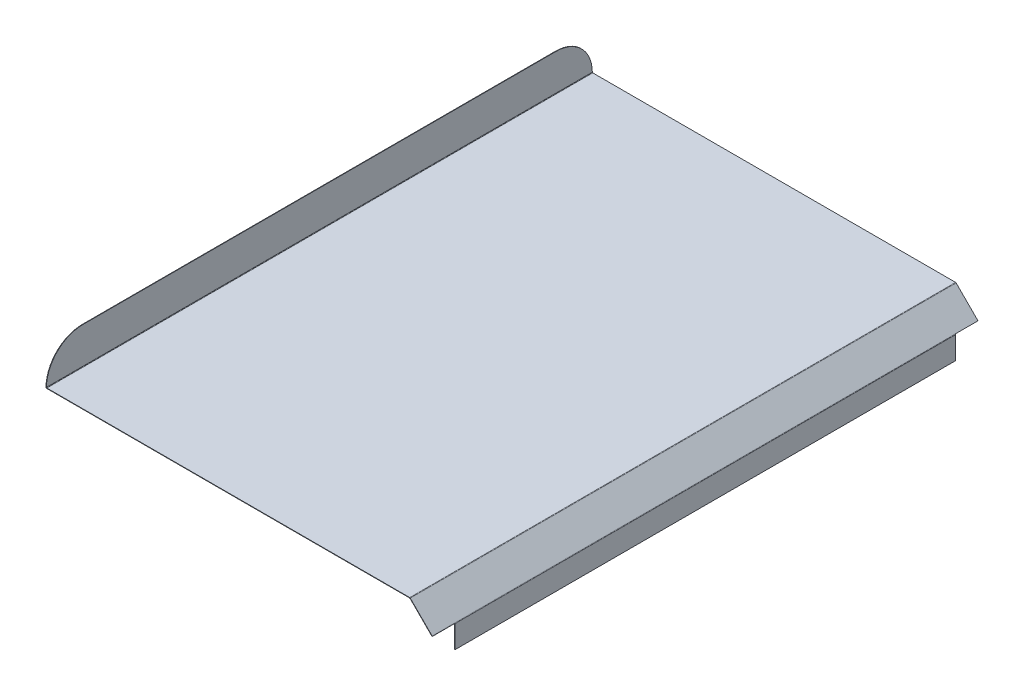
ISO-10303-21;
HEADER;
FILE_DESCRIPTION(('STEP AP214'),'2;1');
FILE_NAME('part.step','',(''),(''),'','','');
FILE_SCHEMA(('AUTOMOTIVE_DESIGN { 1 0 10303 214 1 1 1 1 }'));
ENDSEC;
DATA;
#1=APPLICATION_CONTEXT('core data for automotive mechanical design processes');
#2=APPLICATION_PROTOCOL_DEFINITION('international standard','automotive_design',2000,#1);
#3=PRODUCT_CONTEXT('',#1,'mechanical');
#4=PRODUCT('Part','Part','',(#3));
#5=PRODUCT_RELATED_PRODUCT_CATEGORY('part','',(#4));
#6=PRODUCT_DEFINITION_FORMATION('','',#4);
#7=PRODUCT_DEFINITION_CONTEXT('part definition',#1,'design');
#8=PRODUCT_DEFINITION('design','',#6,#7);
#9=PRODUCT_DEFINITION_SHAPE('','',#8);
#10=(LENGTH_UNIT() NAMED_UNIT(*) SI_UNIT(.MILLI.,.METRE.));
#11=(NAMED_UNIT(*) PLANE_ANGLE_UNIT() SI_UNIT($,.RADIAN.));
#12=(NAMED_UNIT(*) SI_UNIT($,.STERADIAN.) SOLID_ANGLE_UNIT());
#13=UNCERTAINTY_MEASURE_WITH_UNIT(LENGTH_MEASURE(1.E-05),#10,'distance_accuracy_value','');
#14=(GEOMETRIC_REPRESENTATION_CONTEXT(3) GLOBAL_UNCERTAINTY_ASSIGNED_CONTEXT((#13)) GLOBAL_UNIT_ASSIGNED_CONTEXT((#10,
#11,#12)) REPRESENTATION_CONTEXT('',''));
#15=CARTESIAN_POINT('',(0.,0.,0.));
#16=DIRECTION('',(0.,0.,1.));
#17=DIRECTION('',(1.,0.,0.));
#18=AXIS2_PLACEMENT_3D('',#15,#16,#17);
#19=CARTESIAN_POINT('',(368.068690424565,-41.1314321243621,494.25));
#20=DIRECTION('',(0.,0.,1.));
#21=DIRECTION('',(1.,0.,0.));
#22=AXIS2_PLACEMENT_3D('',#19,#20,#21);
#23=CYLINDRICAL_SURFACE('',#22,1.60000000000002);
#24=DIRECTION('',(0.,0.,1.));
#25=VECTOR('',#24,1.);
#26=CARTESIAN_POINT('',(369.565353379275,-40.5657466994128,494.25));
#27=LINE('',#26,#25);
#28=CARTESIAN_POINT('',(369.565353379275,-40.5657466994128,453.45));
#29=VERTEX_POINT('',#28);
#30=CARTESIAN_POINT('',(369.565353379275,-40.5657466994128,494.25));
#31=VERTEX_POINT('',#30);
#32=EDGE_CURVE('E111',#29,#31,#27,.T.);
#33=ORIENTED_EDGE('',*,*,#32,.F.);
#34=CARTESIAN_POINT('',(368.068690424565,-41.1314321243621,453.45));
#35=DIRECTION('',(0.,0.,-1.));
#36=DIRECTION('',(-1.,0.,0.));
#37=AXIS2_PLACEMENT_3D('',#34,#35,#36);
#38=CIRCLE('',#37,1.60000000000002);
#39=CARTESIAN_POINT('',(369.668690424566,-41.131432124362,453.45));
#40=VERTEX_POINT('',#39);
#41=EDGE_CURVE('E923',#40,#29,#38,.F.);
#42=ORIENTED_EDGE('',*,*,#41,.F.);
#43=DIRECTION('',(0.,0.,1.));
#44=VECTOR('',#43,1.);
#45=CARTESIAN_POINT('',(369.668690424566,-41.1314321243621,494.25));
#46=LINE('',#45,#44);
#47=CARTESIAN_POINT('',(369.668690424566,-41.131432124362,-453.45));
#48=VERTEX_POINT('',#47);
#49=EDGE_CURVE('E276',#48,#40,#46,.T.);
#50=ORIENTED_EDGE('',*,*,#49,.F.);
#51=CARTESIAN_POINT('',(368.068690424565,-41.1314321243621,-453.45));
#52=DIRECTION('',(0.,0.,1.));
#53=DIRECTION('',(0.,-1.,0.));
#54=AXIS2_PLACEMENT_3D('',#51,#52,#53);
#55=CIRCLE('',#54,1.60000000000002);
#56=CARTESIAN_POINT('',(369.200061274464,-40.0000612744635,-453.45));
#57=VERTEX_POINT('',#56);
#58=EDGE_CURVE('E794',#57,#48,#55,.F.);
#59=ORIENTED_EDGE('',*,*,#58,.F.);
#60=DIRECTION('',(0.,0.,1.));
#61=VECTOR('',#60,1.);
#62=CARTESIAN_POINT('',(369.200061274464,-40.0000612744635,494.25));
#63=LINE('',#62,#61);
#64=CARTESIAN_POINT('',(369.200061274464,-40.0000612744635,494.25));
#65=VERTEX_POINT('',#64);
#66=EDGE_CURVE('E285',#65,#57,#63,.F.);
#67=ORIENTED_EDGE('',*,*,#66,.F.);
#68=CARTESIAN_POINT('',(368.068690424565,-41.1314321243621,494.25));
#69=DIRECTION('',(0.,0.,1.));
#70=DIRECTION('',(1.,0.,0.));
#71=AXIS2_PLACEMENT_3D('',#68,#69,#70);
#72=CIRCLE('',#71,1.60000000000002);
#73=EDGE_CURVE('E289',#31,#65,#72,.T.);
#74=ORIENTED_EDGE('',*,*,#73,.F.);
#75=EDGE_LOOP('',(#33,#42,#50,#59,#67,#74));
#76=FACE_BOUND('',#75,.T.);
#77=ADVANCED_FACE('F94',(#76),#23,.T.);
#78=CARTESIAN_POINT('',(368.068690424565,-41.1314321243621,494.25));
#79=DIRECTION('',(0.,0.,1.));
#80=DIRECTION('',(1.,0.,0.));
#81=AXIS2_PLACEMENT_3D('',#78,#79,#80);
#82=CYLINDRICAL_SURFACE('',#81,0.800000000000023);
#83=CARTESIAN_POINT('',(368.068690424565,-41.1314321243621,453.45));
#84=DIRECTION('',(0.,0.,1.));
#85=DIRECTION('',(1.,0.,0.));
#86=AXIS2_PLACEMENT_3D('',#83,#84,#85);
#87=CIRCLE('',#86,0.800000000000023);
#88=CARTESIAN_POINT('',(368.868690424566,-41.131432124362,453.45));
#89=VERTEX_POINT('',#88);
#90=CARTESIAN_POINT('',(368.81702190192,-40.8485894118874,453.45));
#91=VERTEX_POINT('',#90);
#92=EDGE_CURVE('E242',#89,#91,#87,.T.);
#93=ORIENTED_EDGE('',*,*,#92,.T.);
#94=DIRECTION('',(0.,0.,1.));
#95=VECTOR('',#94,1.);
#96=CARTESIAN_POINT('',(368.81702190192,-40.8485894118874,494.25));
#97=LINE('',#96,#95);
#98=CARTESIAN_POINT('',(368.81702190192,-40.8485894118874,494.25));
#99=VERTEX_POINT('',#98);
#100=EDGE_CURVE('E251',#91,#99,#97,.T.);
#101=ORIENTED_EDGE('',*,*,#100,.T.);
#102=CARTESIAN_POINT('',(368.068690424565,-41.1314321243621,494.25));
#103=DIRECTION('',(0.,0.,1.));
#104=DIRECTION('',(1.,0.,0.));
#105=AXIS2_PLACEMENT_3D('',#102,#103,#104);
#106=CIRCLE('',#105,0.800000000000023);
#107=CARTESIAN_POINT('',(368.634375849515,-40.5657466994128,494.25));
#108=VERTEX_POINT('',#107);
#109=EDGE_CURVE('E293',#99,#108,#106,.T.);
#110=ORIENTED_EDGE('',*,*,#109,.T.);
#111=DIRECTION('',(0.,0.,1.));
#112=VECTOR('',#111,1.);
#113=CARTESIAN_POINT('',(368.634375849515,-40.5657466994128,494.25));
#114=LINE('',#113,#112);
#115=CARTESIAN_POINT('',(368.634375849515,-40.5657466994128,-453.45));
#116=VERTEX_POINT('',#115);
#117=EDGE_CURVE('E291',#108,#116,#114,.F.);
#118=ORIENTED_EDGE('',*,*,#117,.T.);
#119=CARTESIAN_POINT('',(368.068690424565,-41.1314321243621,-453.45));
#120=DIRECTION('',(0.,0.,1.));
#121=DIRECTION('',(1.,0.,0.));
#122=AXIS2_PLACEMENT_3D('',#119,#120,#121);
#123=CIRCLE('',#122,0.800000000000023);
#124=CARTESIAN_POINT('',(368.868690424566,-41.131432124362,-453.45));
#125=VERTEX_POINT('',#124);
#126=EDGE_CURVE('E275',#116,#125,#123,.F.);
#127=ORIENTED_EDGE('',*,*,#126,.T.);
#128=DIRECTION('',(0.,0.,-1.));
#129=VECTOR('',#128,1.);
#130=CARTESIAN_POINT('',(368.868690424566,-41.131432124362,-494.25));
#131=LINE('',#130,#129);
#132=EDGE_CURVE('E268',#125,#89,#131,.F.);
#133=ORIENTED_EDGE('',*,*,#132,.T.);
#134=EDGE_LOOP('',(#93,#101,#110,#118,#127,#133));
#135=FACE_BOUND('',#134,.T.);
#136=ADVANCED_FACE('F273',(#135),#82,.F.);
#137=CARTESIAN_POINT('',(369.668690424566,-40.8000612744636,494.25));
#138=DIRECTION('',(1.,0.,0.));
#139=DIRECTION('',(0.,1.,0.));
#140=AXIS2_PLACEMENT_3D('',#137,#138,#139);
#141=PLANE('',#140);
#142=ORIENTED_EDGE('',*,*,#49,.T.);
#143=DIRECTION('',(0.,1.,0.));
#144=VECTOR('',#143,1.);
#145=CARTESIAN_POINT('',(369.668690424566,-81.8000612744636,453.45));
#146=LINE('',#145,#144);
#147=CARTESIAN_POINT('',(369.668690424566,-81.8000612744636,453.45));
#148=VERTEX_POINT('',#147);
#149=EDGE_CURVE('E259',#148,#40,#146,.T.);
#150=ORIENTED_EDGE('',*,*,#149,.F.);
#151=DIRECTION('',(0.,0.,1.));
#152=VECTOR('',#151,1.);
#153=CARTESIAN_POINT('',(369.668690424566,-81.8000612744636,494.25));
#154=LINE('',#153,#152);
#155=CARTESIAN_POINT('',(369.668690424566,-81.8000612744636,-453.45));
#156=VERTEX_POINT('',#155);
#157=EDGE_CURVE('E295',#156,#148,#154,.T.);
#158=ORIENTED_EDGE('',*,*,#157,.F.);
#159=DIRECTION('',(0.,1.,0.));
#160=VECTOR('',#159,1.);
#161=CARTESIAN_POINT('',(369.668690424566,-40.8000612744636,-453.45));
#162=LINE('',#161,#160);
#163=EDGE_CURVE('E119',#48,#156,#162,.F.);
#164=ORIENTED_EDGE('',*,*,#163,.F.);
#165=EDGE_LOOP('',(#142,#150,#158,#164));
#166=FACE_BOUND('',#165,.T.);
#167=ADVANCED_FACE('F412',(#166),#141,.T.);
#168=CARTESIAN_POINT('',(368.868690424566,-40.8000612744636,494.25));
#169=DIRECTION('',(1.,0.,0.));
#170=DIRECTION('',(0.,1.,0.));
#171=AXIS2_PLACEMENT_3D('',#168,#169,#170);
#172=PLANE('',#171);
#173=DIRECTION('',(0.,1.,0.));
#174=VECTOR('',#173,1.);
#175=CARTESIAN_POINT('',(368.868690424566,-40.8000612744636,453.45));
#176=LINE('',#175,#174);
#177=CARTESIAN_POINT('',(368.868690424566,-81.8000612744636,453.45));
#178=VERTEX_POINT('',#177);
#179=EDGE_CURVE('E256',#178,#89,#176,.T.);
#180=ORIENTED_EDGE('',*,*,#179,.T.);
#181=ORIENTED_EDGE('',*,*,#132,.F.);
#182=DIRECTION('',(0.,-1.,0.));
#183=VECTOR('',#182,1.);
#184=CARTESIAN_POINT('',(368.868690424566,-81.8000612744636,-453.45));
#185=LINE('',#184,#183);
#186=CARTESIAN_POINT('',(368.868690424566,-81.8000612744636,-453.45));
#187=VERTEX_POINT('',#186);
#188=EDGE_CURVE('E803',#125,#187,#185,.T.);
#189=ORIENTED_EDGE('',*,*,#188,.T.);
#190=DIRECTION('',(0.,0.,-1.));
#191=VECTOR('',#190,1.);
#192=CARTESIAN_POINT('',(368.868690424566,-81.8000612744636,494.25));
#193=LINE('',#192,#191);
#194=EDGE_CURVE('E270',#187,#178,#193,.F.);
#195=ORIENTED_EDGE('',*,*,#194,.T.);
#196=EDGE_LOOP('',(#180,#181,#189,#195));
#197=FACE_BOUND('',#196,.T.);
#198=ADVANCED_FACE('F266',(#197),#172,.F.);
#199=CARTESIAN_POINT('',(369.668690424566,-81.8000612744636,494.25));
#200=DIRECTION('',(0.,-1.,0.));
#201=DIRECTION('',(1.,0.,0.));
#202=AXIS2_PLACEMENT_3D('',#199,#200,#201);
#203=PLANE('',#202);
#204=ORIENTED_EDGE('',*,*,#157,.T.);
#205=DIRECTION('',(1.,0.,0.));
#206=VECTOR('',#205,1.);
#207=CARTESIAN_POINT('',(369.668690424566,-81.8000612744636,453.45));
#208=LINE('',#207,#206);
#209=EDGE_CURVE('E261',#148,#178,#208,.F.);
#210=ORIENTED_EDGE('',*,*,#209,.T.);
#211=ORIENTED_EDGE('',*,*,#194,.F.);
#212=DIRECTION('',(-1.,0.,0.));
#213=VECTOR('',#212,1.);
#214=CARTESIAN_POINT('',(368.868690424566,-81.8000612744636,-453.45));
#215=LINE('',#214,#213);
#216=EDGE_CURVE('E277',#187,#156,#215,.F.);
#217=ORIENTED_EDGE('',*,*,#216,.T.);
#218=EDGE_LOOP('',(#204,#210,#211,#217));
#219=FACE_BOUND('',#218,.T.);
#220=ADVANCED_FACE('F408',(#219),#203,.T.);
#221=CARTESIAN_POINT('',(368.068690424565,-41.1314321243621,494.25));
#222=DIRECTION('',(0.,0.,-1.));
#223=DIRECTION('',(-1.,0.,0.));
#224=AXIS2_PLACEMENT_3D('',#221,#222,#223);
#225=PLANE('',#224);
#226=ORIENTED_EDGE('',*,*,#109,.F.);
#227=DIRECTION('',(0.935414346693475,0.353553390593302,0.));
#228=VECTOR('',#227,1.);
#229=CARTESIAN_POINT('',(369.565353379275,-40.5657466994128,494.25));
#230=LINE('',#229,#228);
#231=EDGE_CURVE('E810',#31,#99,#230,.F.);
#232=ORIENTED_EDGE('',*,*,#231,.F.);
#233=ORIENTED_EDGE('',*,*,#73,.T.);
#234=DIRECTION('',(0.707106781186517,0.707106781186578,0.));
#235=VECTOR('',#234,1.);
#236=CARTESIAN_POINT('',(368.634375849515,-40.5657466994128,494.25));
#237=LINE('',#236,#235);
#238=EDGE_CURVE('E288',#108,#65,#237,.T.);
#239=ORIENTED_EDGE('',*,*,#238,.F.);
#240=EDGE_LOOP('',(#226,#232,#233,#239));
#241=FACE_BOUND('',#240,.T.);
#242=ADVANCED_FACE('F396',(#241),#225,.F.);
#243=CARTESIAN_POINT('',(329.434314575051,-0.234314575050754,494.25));
#244=DIRECTION('',(0.,0.,1.));
#245=DIRECTION('',(1.,0.,0.));
#246=AXIS2_PLACEMENT_3D('',#243,#244,#245);
#247=PLANE('',#246);
#248=DIRECTION('',(0.707106781186551,-0.707106781186544,0.));
#249=VECTOR('',#248,1.);
#250=CARTESIAN_POINT('',(328.868629150102,-0.799999999999995,494.25));
#251=LINE('',#250,#249);
#252=CARTESIAN_POINT('',(329.102943725152,-1.03431457505054,494.25));
#253=VERTEX_POINT('',#252);
#254=EDGE_CURVE('E307',#108,#253,#251,.F.);
#255=ORIENTED_EDGE('',*,*,#254,.F.);
#256=ORIENTED_EDGE('',*,*,#238,.T.);
#257=DIRECTION('',(-0.707106781186551,0.707106781186544,0.));
#258=VECTOR('',#257,1.);
#259=CARTESIAN_POINT('',(329.434314575051,-0.234314575050754,494.25));
#260=LINE('',#259,#258);
#261=CARTESIAN_POINT('',(329.668629150101,-0.468629150101474,494.25));
#262=VERTEX_POINT('',#261);
#263=EDGE_CURVE('E301',#65,#262,#260,.T.);
#264=ORIENTED_EDGE('',*,*,#263,.T.);
#265=DIRECTION('',(0.707106781186544,0.707106781186551,0.));
#266=VECTOR('',#265,1.);
#267=CARTESIAN_POINT('',(329.102943725152,-1.0343145750507,494.25));
#268=LINE('',#267,#266);
#269=EDGE_CURVE('E315',#253,#262,#268,.T.);
#270=ORIENTED_EDGE('',*,*,#269,.F.);
#271=EDGE_LOOP('',(#255,#256,#264,#270));
#272=FACE_BOUND('',#271,.T.);
#273=ADVANCED_FACE('F392',(#272),#247,.T.);
#274=CARTESIAN_POINT('',(329.434314575051,-0.234314575050754,494.25));
#275=DIRECTION('',(0.707106781186544,0.707106781186551,0.));
#276=DIRECTION('',(-0.707106781186551,0.707106781186544,0.));
#277=AXIS2_PLACEMENT_3D('',#274,#275,#276);
#278=PLANE('',#277);
#279=ORIENTED_EDGE('',*,*,#263,.F.);
#280=ORIENTED_EDGE('',*,*,#66,.T.);
#281=DIRECTION('',(0.,0.,1.));
#282=VECTOR('',#281,1.);
#283=CARTESIAN_POINT('',(369.200061274464,-40.0000612744635,494.25));
#284=LINE('',#283,#282);
#285=CARTESIAN_POINT('',(369.200061274464,-40.0000612744635,-494.25));
#286=VERTEX_POINT('',#285);
#287=EDGE_CURVE('E260',#57,#286,#284,.F.);
#288=ORIENTED_EDGE('',*,*,#287,.T.);
#289=DIRECTION('',(0.707106781186551,-0.707106781186544,0.));
#290=VECTOR('',#289,1.);
#291=CARTESIAN_POINT('',(370.234375849515,-41.0343758495143,-494.25));
#292=LINE('',#291,#290);
#293=CARTESIAN_POINT('',(329.668629150102,-0.468629150101538,-494.25));
#294=VERTEX_POINT('',#293);
#295=EDGE_CURVE('E304',#294,#286,#292,.T.);
#296=ORIENTED_EDGE('',*,*,#295,.F.);
#297=DIRECTION('',(0.,0.,1.));
#298=VECTOR('',#297,1.);
#299=CARTESIAN_POINT('',(329.668629150101,-0.468629150101473,494.25));
#300=LINE('',#299,#298);
#301=EDGE_CURVE('E312',#294,#262,#300,.T.);
#302=ORIENTED_EDGE('',*,*,#301,.T.);
#303=EDGE_LOOP('',(#279,#280,#288,#296,#302));
#304=FACE_BOUND('',#303,.T.);
#305=ADVANCED_FACE('F395',(#304),#278,.T.);
#306=CARTESIAN_POINT('',(328.868629150102,-0.799999999999995,494.25));
#307=DIRECTION('',(0.707106781186544,0.707106781186551,0.));
#308=DIRECTION('',(-0.707106781186551,0.707106781186544,0.));
#309=AXIS2_PLACEMENT_3D('',#306,#307,#308);
#310=PLANE('',#309);
#311=ORIENTED_EDGE('',*,*,#117,.F.);
#312=ORIENTED_EDGE('',*,*,#254,.T.);
#313=DIRECTION('',(0.,0.,-1.));
#314=VECTOR('',#313,1.);
#315=CARTESIAN_POINT('',(329.102943725152,-1.03431457505078,-494.25));
#316=LINE('',#315,#314);
#317=CARTESIAN_POINT('',(329.102943725152,-1.0343145750508,-494.25));
#318=VERTEX_POINT('',#317);
#319=EDGE_CURVE('E318',#318,#253,#316,.F.);
#320=ORIENTED_EDGE('',*,*,#319,.F.);
#321=DIRECTION('',(-0.707106781186551,0.707106781186544,0.));
#322=VECTOR('',#321,1.);
#323=CARTESIAN_POINT('',(328.868629150102,-0.799999999999995,-494.25));
#324=LINE('',#323,#322);
#325=CARTESIAN_POINT('',(368.634375849515,-40.5657466994128,-494.25));
#326=VERTEX_POINT('',#325);
#327=EDGE_CURVE('E309',#318,#326,#324,.F.);
#328=ORIENTED_EDGE('',*,*,#327,.T.);
#329=DIRECTION('',(0.,0.,1.));
#330=VECTOR('',#329,1.);
#331=CARTESIAN_POINT('',(368.634375849515,-40.5657466994128,494.25));
#332=LINE('',#331,#330);
#333=EDGE_CURVE('E796',#116,#326,#332,.F.);
#334=ORIENTED_EDGE('',*,*,#333,.F.);
#335=EDGE_LOOP('',(#311,#312,#320,#328,#334));
#336=FACE_BOUND('',#335,.T.);
#337=ADVANCED_FACE('F398',(#336),#310,.F.);
#338=CARTESIAN_POINT('',(-330.,-0.8,494.25));
#339=DIRECTION('',(0.,0.,1.));
#340=DIRECTION('',(1.,0.,0.));
#341=AXIS2_PLACEMENT_3D('',#338,#339,#340);
#342=PLANE('',#341);
#343=DIRECTION('',(1.,0.,0.));
#344=VECTOR('',#343,1.);
#345=CARTESIAN_POINT('',(-330.,-0.8,494.25));
#346=LINE('',#345,#344);
#347=CARTESIAN_POINT('',(-328.4,-0.799999999999997,494.25));
#348=VERTEX_POINT('',#347);
#349=CARTESIAN_POINT('',(328.537258300203,-0.8,494.25));
#350=VERTEX_POINT('',#349);
#351=EDGE_CURVE('E13',#348,#350,#346,.T.);
#352=ORIENTED_EDGE('',*,*,#351,.T.);
#353=DIRECTION('',(0.,1.,0.));
#354=VECTOR('',#353,1.);
#355=CARTESIAN_POINT('',(328.537258300203,-0.799999999999782,494.25));
#356=LINE('',#355,#354);
#357=CARTESIAN_POINT('',(328.537258300203,2.18141477104083E-13,494.25));
#358=VERTEX_POINT('',#357);
#359=EDGE_CURVE('E330',#350,#358,#356,.T.);
#360=ORIENTED_EDGE('',*,*,#359,.T.);
#361=DIRECTION('',(1.,0.,0.));
#362=VECTOR('',#361,1.);
#363=CARTESIAN_POINT('',(-330.,0.,494.25));
#364=LINE('',#363,#362);
#365=CARTESIAN_POINT('',(-328.4,0.,494.25));
#366=VERTEX_POINT('',#365);
#367=EDGE_CURVE('E98',#366,#358,#364,.T.);
#368=ORIENTED_EDGE('',*,*,#367,.F.);
#369=DIRECTION('',(0.,-1.,0.));
#370=VECTOR('',#369,1.);
#371=CARTESIAN_POINT('',(-328.4,0.,494.25));
#372=LINE('',#371,#370);
#373=EDGE_CURVE('E829',#366,#348,#372,.T.);
#374=ORIENTED_EDGE('',*,*,#373,.T.);
#375=EDGE_LOOP('',(#352,#360,#368,#374));
#376=FACE_BOUND('',#375,.T.);
#377=ADVANCED_FACE('F401',(#376),#342,.T.);
#378=CARTESIAN_POINT('',(330.,-0.8,-494.25));
#379=DIRECTION('',(0.,-1.,0.));
#380=DIRECTION('',(0.,0.,-1.));
#381=AXIS2_PLACEMENT_3D('',#378,#379,#380);
#382=PLANE('',#381);
#383=DIRECTION('',(-1.,0.,0.));
#384=VECTOR('',#383,1.);
#385=CARTESIAN_POINT('',(-330.,-0.8,-494.25));
#386=LINE('',#385,#384);
#387=CARTESIAN_POINT('',(328.537258300203,-0.8,-494.25));
#388=VERTEX_POINT('',#387);
#389=CARTESIAN_POINT('',(-328.4,-0.8,-494.25));
#390=VERTEX_POINT('',#389);
#391=EDGE_CURVE('E103',#388,#390,#386,.T.);
#392=ORIENTED_EDGE('',*,*,#391,.F.);
#393=DIRECTION('',(0.,0.,1.));
#394=VECTOR('',#393,1.);
#395=CARTESIAN_POINT('',(328.537258300203,-0.799999999999782,494.25));
#396=LINE('',#395,#394);
#397=EDGE_CURVE('E336',#350,#388,#396,.F.);
#398=ORIENTED_EDGE('',*,*,#397,.F.);
#399=ORIENTED_EDGE('',*,*,#351,.F.);
#400=DIRECTION('',(0.,0.,1.));
#401=VECTOR('',#400,1.);
#402=CARTESIAN_POINT('',(-328.4,-0.799999999999997,494.25));
#403=LINE('',#402,#401);
#404=EDGE_CURVE('E782',#348,#390,#403,.F.);
#405=ORIENTED_EDGE('',*,*,#404,.T.);
#406=EDGE_LOOP('',(#392,#398,#399,#405));
#407=FACE_BOUND('',#406,.T.);
#408=ADVANCED_FACE('F587',(#407),#382,.T.);
#409=CARTESIAN_POINT('',(330.,0.,-494.25));
#410=DIRECTION('',(0.,-1.,0.));
#411=DIRECTION('',(0.,0.,-1.));
#412=AXIS2_PLACEMENT_3D('',#409,#410,#411);
#413=PLANE('',#412);
#414=DIRECTION('',(0.,0.,1.));
#415=VECTOR('',#414,1.);
#416=CARTESIAN_POINT('',(328.537258300203,2.18141477104083E-13,494.25));
#417=LINE('',#416,#415);
#418=CARTESIAN_POINT('',(328.537258300203,0.,-494.25));
#419=VERTEX_POINT('',#418);
#420=EDGE_CURVE('E323',#358,#419,#417,.F.);
#421=ORIENTED_EDGE('',*,*,#420,.T.);
#422=DIRECTION('',(-1.,0.,0.));
#423=VECTOR('',#422,1.);
#424=CARTESIAN_POINT('',(-330.,0.,-494.25));
#425=LINE('',#424,#423);
#426=CARTESIAN_POINT('',(-328.4,0.,-494.25));
#427=VERTEX_POINT('',#426);
#428=EDGE_CURVE('E776',#419,#427,#425,.T.);
#429=ORIENTED_EDGE('',*,*,#428,.T.);
#430=DIRECTION('',(0.,0.,1.));
#431=VECTOR('',#430,1.);
#432=CARTESIAN_POINT('',(-328.4,0.,494.25));
#433=LINE('',#432,#431);
#434=EDGE_CURVE('E826',#366,#427,#433,.F.);
#435=ORIENTED_EDGE('',*,*,#434,.F.);
#436=ORIENTED_EDGE('',*,*,#367,.T.);
#437=EDGE_LOOP('',(#421,#429,#435,#436));
#438=FACE_BOUND('',#437,.T.);
#439=ADVANCED_FACE('F598',(#438),#413,.F.);
#440=CARTESIAN_POINT('',(-328.4,0.800000000000026,494.25));
#441=DIRECTION('',(0.,0.,1.));
#442=DIRECTION('',(-1.,0.,0.));
#443=AXIS2_PLACEMENT_3D('',#440,#441,#442);
#444=CYLINDRICAL_SURFACE('',#443,1.60000000000002);
#445=CARTESIAN_POINT('',(-328.4,0.800000000000026,494.25));
#446=DIRECTION('',(0.,0.,1.));
#447=DIRECTION('',(1.,0.,0.));
#448=AXIS2_PLACEMENT_3D('',#445,#446,#447);
#449=CIRCLE('',#448,1.60000000000002);
#450=CARTESIAN_POINT('',(-329.883239697419,0.199999999999559,494.25));
#451=VERTEX_POINT('',#450);
#452=EDGE_CURVE('E846',#451,#348,#449,.T.);
#453=ORIENTED_EDGE('',*,*,#452,.F.);
#454=CARTESIAN_POINT('',(-330.,0.80000000000002,494.247272670922));
#455=CARTESIAN_POINT('',(-330.000008165825,0.748112827157412,494.247745067792));
#456=CARTESIAN_POINT('',(-329.997476101375,0.696225511958834,494.248154644208));
#457=CARTESIAN_POINT('',(-329.987391546746,0.592940024129236,494.248849700947));
#458=CARTESIAN_POINT('',(-329.979839056153,0.541541851538596,494.249135181259));
#459=CARTESIAN_POINT('',(-329.960024882871,0.440998743574533,494.249577976888));
#460=CARTESIAN_POINT('',(-329.947885843802,0.391829613249013,494.249738322235));
#461=CARTESIAN_POINT('',(-329.918995645034,0.294804113271127,494.249949646882));
#462=CARTESIAN_POINT('',(-329.902239221367,0.246949310882068,494.250000500772));
#463=CARTESIAN_POINT('',(-329.883239697419,0.199999999999542,494.25));
#464=B_SPLINE_CURVE_WITH_KNOTS('',3,(#454,#455,#456,#457,#458,#459,#460,#461,#462,#463),
.UNSPECIFIED.,.F.,.F.,(4,2,2,2,4),(0.,0.15560615031475,0.311212313475033,0.462922403342743,
0.614806168307939),.UNSPECIFIED.);
#465=CARTESIAN_POINT('',(-330.,0.80000000000002,494.247272670922));
#466=VERTEX_POINT('',#465);
#467=EDGE_CURVE('E344',#466,#451,#464,.T.);
#468=ORIENTED_EDGE('',*,*,#467,.F.);
#469=DIRECTION('',(0.,0.,1.));
#470=VECTOR('',#469,1.);
#471=CARTESIAN_POINT('',(-330.,0.80000000000002,-494.25));
#472=LINE('',#471,#470);
#473=CARTESIAN_POINT('',(-330.,0.800000000000023,-494.247272670922));
#474=VERTEX_POINT('',#473);
#475=EDGE_CURVE('E852',#466,#474,#472,.F.);
#476=ORIENTED_EDGE('',*,*,#475,.T.);
#477=CARTESIAN_POINT('',(-329.883239697419,0.19999999999955,-494.25));
#478=CARTESIAN_POINT('',(-329.902697016451,0.248078066805165,-494.250000444296));
#479=CARTESIAN_POINT('',(-329.919801254527,0.297107510765441,-494.249946633735));
#480=CARTESIAN_POINT('',(-329.949176137379,0.396593549607805,-494.249723816894));
#481=CARTESIAN_POINT('',(-329.961446781845,0.447050144581192,-494.249554810608));
#482=CARTESIAN_POINT('',(-329.980790579369,0.547684689898405,-494.249100470301));
#483=CARTESIAN_POINT('',(-329.987982110631,0.597839934915065,-494.248818044576));
#484=CARTESIAN_POINT('',(-329.997593092116,0.698662711188526,-494.248134771828));
#485=CARTESIAN_POINT('',(-330.00000705999,0.749330763995787,-494.247733789363));
#486=CARTESIAN_POINT('',(-330.,0.800000000000016,-494.247272670922));
#487=B_SPLINE_CURVE_WITH_KNOTS('',3,(#477,#478,#479,#480,#481,#482,#483,#484,#485,#486),
.UNSPECIFIED.,.F.,.F.,(4,2,2,2,4),(0.,0.155536377424045,0.311072764798208,0.462852431529624,
0.614806167696447),.UNSPECIFIED.);
#488=CARTESIAN_POINT('',(-329.883239697419,0.199999999999548,-494.25));
#489=VERTEX_POINT('',#488);
#490=EDGE_CURVE('E870',#489,#474,#487,.T.);
#491=ORIENTED_EDGE('',*,*,#490,.F.);
#492=CARTESIAN_POINT('',(-328.4,0.800000000000026,-494.25));
#493=DIRECTION('',(0.,0.,1.));
#494=DIRECTION('',(1.,0.,0.));
#495=AXIS2_PLACEMENT_3D('',#492,#493,#494);
#496=CIRCLE('',#495,1.60000000000002);
#497=EDGE_CURVE('E832',#390,#489,#496,.F.);
#498=ORIENTED_EDGE('',*,*,#497,.F.);
#499=ORIENTED_EDGE('',*,*,#404,.F.);
#500=EDGE_LOOP('',(#453,#468,#476,#491,#498,#499));
#501=FACE_BOUND('',#500,.T.);
#502=ADVANCED_FACE('F609',(#501),#444,.T.);
#503=CARTESIAN_POINT('',(-328.4,0.800000000000026,494.25));
#504=DIRECTION('',(0.,0.,1.));
#505=DIRECTION('',(-1.,0.,0.));
#506=AXIS2_PLACEMENT_3D('',#503,#504,#505);
#507=CYLINDRICAL_SURFACE('',#506,0.800000000000023);
#508=CARTESIAN_POINT('',(-329.2,0.800000000000023,494.247272670922));
#509=CARTESIAN_POINT('',(-329.200032584854,0.749639442647519,494.248195073672));
#510=CARTESIAN_POINT('',(-329.195240940951,0.699370857377995,494.248869778244));
#511=CARTESIAN_POINT('',(-329.180939418264,0.624489219475675,494.249548804069));
#512=CARTESIAN_POINT('',(-329.174825369768,0.599209410874391,494.249719517481));
#513=CARTESIAN_POINT('',(-329.160099864541,0.54912184030672,494.249946264086));
#514=CARTESIAN_POINT('',(-329.151464839407,0.524321002953944,494.250001172844));
#515=CARTESIAN_POINT('',(-329.141619848709,0.499999999999773,494.25));
#516=B_SPLINE_CURVE_WITH_KNOTS('',3,(#508,#509,#510,#511,#512,#513,#514,#515),.UNSPECIFIED.,.F.,
.F.,(4,2,2,4),(0.,0.150670857727044,0.228582441071296,0.30724710796642),.UNSPECIFIED.);
#517=CARTESIAN_POINT('',(-329.2,0.800000000000023,494.247272670922));
#518=VERTEX_POINT('',#517);
#519=CARTESIAN_POINT('',(-329.141619848709,0.499999999999774,494.25));
#520=VERTEX_POINT('',#519);
#521=EDGE_CURVE('E350',#518,#520,#516,.T.);
#522=ORIENTED_EDGE('',*,*,#521,.T.);
#523=CARTESIAN_POINT('',(-328.4,0.800000000000026,494.25));
#524=DIRECTION('',(0.,0.,1.));
#525=DIRECTION('',(1.,0.,0.));
#526=AXIS2_PLACEMENT_3D('',#523,#524,#525);
#527=CIRCLE('',#526,0.800000000000023);
#528=EDGE_CURVE('E839',#520,#366,#527,.T.);
#529=ORIENTED_EDGE('',*,*,#528,.T.);
#530=ORIENTED_EDGE('',*,*,#434,.T.);
#531=CARTESIAN_POINT('',(-328.4,0.800000000000026,-494.25));
#532=DIRECTION('',(0.,0.,1.));
#533=DIRECTION('',(1.,0.,0.));
#534=AXIS2_PLACEMENT_3D('',#531,#532,#533);
#535=CIRCLE('',#534,0.800000000000023);
#536=CARTESIAN_POINT('',(-329.141619848709,0.499999999999782,-494.25));
#537=VERTEX_POINT('',#536);
#538=EDGE_CURVE('E843',#427,#537,#535,.F.);
#539=ORIENTED_EDGE('',*,*,#538,.T.);
#540=CARTESIAN_POINT('',(-329.141619848709,0.499999999999778,-494.25));
#541=CARTESIAN_POINT('',(-329.160538400305,0.546681097047397,-494.250005038143));
#542=CARTESIAN_POINT('',(-329.174947213448,0.595082434775015,-494.249798192124));
#543=CARTESIAN_POINT('',(-329.189768822904,0.669863075939092,-494.24914237887));
#544=CARTESIAN_POINT('',(-329.19358027006,0.6955899402515,-494.248858567873));
#545=CARTESIAN_POINT('',(-329.198711170225,0.747540359711493,-494.248163296038));
#546=CARTESIAN_POINT('',(-329.200006179897,0.773766312171826,-494.247750627872));
#547=CARTESIAN_POINT('',(-329.2,0.800000000000021,-494.247272670922));
#548=B_SPLINE_CURVE_WITH_KNOTS('',3,(#540,#541,#542,#543,#544,#545,#546,#547),.UNSPECIFIED.,.F.,
.F.,(4,2,2,4),(0.,0.150670867884921,0.228582439155398,0.307247091925359),.UNSPECIFIED.);
#549=CARTESIAN_POINT('',(-329.2,0.800000000000022,-494.247272670922));
#550=VERTEX_POINT('',#549);
#551=EDGE_CURVE('E877',#537,#550,#548,.T.);
#552=ORIENTED_EDGE('',*,*,#551,.T.);
#553=DIRECTION('',(0.,0.,1.));
#554=VECTOR('',#553,1.);
#555=CARTESIAN_POINT('',(-329.2,0.800000000000023,-494.25));
#556=LINE('',#555,#554);
#557=EDGE_CURVE('E849',#550,#518,#556,.T.);
#558=ORIENTED_EDGE('',*,*,#557,.T.);
#559=EDGE_LOOP('',(#522,#529,#530,#539,#552,#558));
#560=FACE_BOUND('',#559,.T.);
#561=ADVANCED_FACE('F662',(#560),#507,.F.);
#562=CARTESIAN_POINT('',(-330.,66.2,-494.25));
#563=DIRECTION('',(1.,0.,0.));
#564=DIRECTION('',(0.,1.,0.));
#565=AXIS2_PLACEMENT_3D('',#562,#563,#564);
#566=PLANE('',#565);
#567=CARTESIAN_POINT('',(-330.,0.200000000000023,428.25));
#568=DIRECTION('',(1.,0.,0.));
#569=DIRECTION('',(0.,1.,0.));
#570=AXIS2_PLACEMENT_3D('',#567,#568,#569);
#571=CIRCLE('',#570,66.);
#572=CARTESIAN_POINT('',(-330.,66.2,428.25));
#573=VERTEX_POINT('',#572);
#574=EDGE_CURVE('E349',#573,#466,#571,.T.);
#575=ORIENTED_EDGE('',*,*,#574,.F.);
#576=DIRECTION('',(0.,0.,-1.));
#577=VECTOR('',#576,1.);
#578=CARTESIAN_POINT('',(-330.,66.2,-494.25));
#579=LINE('',#578,#577);
#580=CARTESIAN_POINT('',(-330.,66.2,-428.25));
#581=VERTEX_POINT('',#580);
#582=EDGE_CURVE('E841',#573,#581,#579,.T.);
#583=ORIENTED_EDGE('',*,*,#582,.T.);
#584=CARTESIAN_POINT('',(-330.,0.200000000000009,-428.25));
#585=DIRECTION('',(1.,0.,0.));
#586=DIRECTION('',(0.,1.,0.));
#587=AXIS2_PLACEMENT_3D('',#584,#585,#586);
#588=CIRCLE('',#587,66.);
#589=EDGE_CURVE('E861',#474,#581,#588,.T.);
#590=ORIENTED_EDGE('',*,*,#589,.F.);
#591=ORIENTED_EDGE('',*,*,#475,.F.);
#592=EDGE_LOOP('',(#575,#583,#590,#591));
#593=FACE_BOUND('',#592,.T.);
#594=ADVANCED_FACE('F673',(#593),#566,.F.);
#595=CARTESIAN_POINT('',(-329.2,66.2,-494.25));
#596=DIRECTION('',(1.,0.,0.));
#597=DIRECTION('',(0.,1.,0.));
#598=AXIS2_PLACEMENT_3D('',#595,#596,#597);
#599=PLANE('',#598);
#600=DIRECTION('',(0.,0.,1.));
#601=VECTOR('',#600,1.);
#602=CARTESIAN_POINT('',(-329.2,66.2,-494.25));
#603=LINE('',#602,#601);
#604=CARTESIAN_POINT('',(-329.2,66.2,428.25));
#605=VERTEX_POINT('',#604);
#606=CARTESIAN_POINT('',(-329.2,66.2,-428.25));
#607=VERTEX_POINT('',#606);
#608=EDGE_CURVE('E855',#605,#607,#603,.F.);
#609=ORIENTED_EDGE('',*,*,#608,.F.);
#610=CARTESIAN_POINT('',(-329.2,0.200000000000026,428.25));
#611=DIRECTION('',(1.,0.,0.));
#612=DIRECTION('',(0.,1.,0.));
#613=AXIS2_PLACEMENT_3D('',#610,#611,#612);
#614=CIRCLE('',#613,66.);
#615=EDGE_CURVE('E901',#605,#518,#614,.T.);
#616=ORIENTED_EDGE('',*,*,#615,.T.);
#617=ORIENTED_EDGE('',*,*,#557,.F.);
#618=CARTESIAN_POINT('',(-329.2,0.200000000000012,-428.25));
#619=DIRECTION('',(1.,0.,0.));
#620=DIRECTION('',(0.,-1.,0.));
#621=AXIS2_PLACEMENT_3D('',#618,#619,#620);
#622=CIRCLE('',#621,66.);
#623=EDGE_CURVE('E864',#550,#607,#622,.T.);
#624=ORIENTED_EDGE('',*,*,#623,.T.);
#625=EDGE_LOOP('',(#609,#616,#617,#624));
#626=FACE_BOUND('',#625,.T.);
#627=ADVANCED_FACE('F684',(#626),#599,.T.);
#628=CARTESIAN_POINT('',(-330.,66.2,-494.25));
#629=DIRECTION('',(0.,-1.,0.));
#630=DIRECTION('',(1.,0.,0.));
#631=AXIS2_PLACEMENT_3D('',#628,#629,#630);
#632=PLANE('',#631);
#633=ORIENTED_EDGE('',*,*,#582,.F.);
#634=DIRECTION('',(-1.,0.,0.));
#635=VECTOR('',#634,1.);
#636=CARTESIAN_POINT('',(-330.,66.2,428.25));
#637=LINE('',#636,#635);
#638=EDGE_CURVE('E878',#573,#605,#637,.F.);
#639=ORIENTED_EDGE('',*,*,#638,.T.);
#640=ORIENTED_EDGE('',*,*,#608,.T.);
#641=DIRECTION('',(1.,0.,0.));
#642=VECTOR('',#641,1.);
#643=CARTESIAN_POINT('',(-329.2,66.2,-428.25));
#644=LINE('',#643,#642);
#645=EDGE_CURVE('E858',#607,#581,#644,.F.);
#646=ORIENTED_EDGE('',*,*,#645,.T.);
#647=EDGE_LOOP('',(#633,#639,#640,#646));
#648=FACE_BOUND('',#647,.T.);
#649=ADVANCED_FACE('F695',(#648),#632,.F.);
#650=CARTESIAN_POINT('',(-330.,-0.8,-494.25));
#651=DIRECTION('',(0.,0.,-1.));
#652=DIRECTION('',(-1.,0.,0.));
#653=AXIS2_PLACEMENT_3D('',#650,#651,#652);
#654=PLANE('',#653);
#655=DIRECTION('',(0.,1.,-2.77555756156285E-13));
#656=VECTOR('',#655,1.);
#657=CARTESIAN_POINT('',(328.537258300203,-0.800000000000034,-494.25));
#658=LINE('',#657,#656);
#659=EDGE_CURVE('E341',#388,#419,#658,.T.);
#660=ORIENTED_EDGE('',*,*,#659,.F.);
#661=ORIENTED_EDGE('',*,*,#391,.T.);
#662=DIRECTION('',(0.,-1.,0.));
#663=VECTOR('',#662,1.);
#664=CARTESIAN_POINT('',(-328.4,0.,-494.25));
#665=LINE('',#664,#663);
#666=EDGE_CURVE('E831',#427,#390,#665,.T.);
#667=ORIENTED_EDGE('',*,*,#666,.F.);
#668=ORIENTED_EDGE('',*,*,#428,.F.);
#669=EDGE_LOOP('',(#660,#661,#667,#668));
#670=FACE_BOUND('',#669,.T.);
#671=ADVANCED_FACE('F96',(#670),#654,.T.);
#672=CARTESIAN_POINT('',(-328.4,0.800000000000026,-494.25));
#673=DIRECTION('',(0.,0.,-1.));
#674=DIRECTION('',(-1.,0.,0.));
#675=AXIS2_PLACEMENT_3D('',#672,#673,#674);
#676=PLANE('',#675);
#677=DIRECTION('',(0.927024810886838,0.375000000000295,0.));
#678=VECTOR('',#677,1.);
#679=CARTESIAN_POINT('',(-329.883239697419,0.199999999999538,-494.25));
#680=LINE('',#679,#678);
#681=EDGE_CURVE('E867',#489,#537,#680,.T.);
#682=ORIENTED_EDGE('',*,*,#681,.T.);
#683=ORIENTED_EDGE('',*,*,#538,.F.);
#684=ORIENTED_EDGE('',*,*,#666,.T.);
#685=ORIENTED_EDGE('',*,*,#497,.T.);
#686=EDGE_LOOP('',(#682,#683,#684,#685));
#687=FACE_BOUND('',#686,.T.);
#688=ADVANCED_FACE('F714',(#687),#676,.T.);
#689=CARTESIAN_POINT('',(-328.4,0.800000000000026,494.25));
#690=DIRECTION('',(0.,0.,-1.));
#691=DIRECTION('',(-1.,0.,0.));
#692=AXIS2_PLACEMENT_3D('',#689,#690,#691);
#693=PLANE('',#692);
#694=DIRECTION('',(-0.927024810886838,-0.375000000000295,0.));
#695=VECTOR('',#694,1.);
#696=CARTESIAN_POINT('',(-329.141619848709,0.499999999999771,494.25));
#697=LINE('',#696,#695);
#698=EDGE_CURVE('E347',#451,#520,#697,.F.);
#699=ORIENTED_EDGE('',*,*,#698,.F.);
#700=ORIENTED_EDGE('',*,*,#452,.T.);
#701=ORIENTED_EDGE('',*,*,#373,.F.);
#702=ORIENTED_EDGE('',*,*,#528,.F.);
#703=EDGE_LOOP('',(#699,#700,#701,#702));
#704=FACE_BOUND('',#703,.T.);
#705=ADVANCED_FACE('F650',(#704),#693,.F.);
#706=CARTESIAN_POINT('',(-329.2,0.200000000000012,-428.25));
#707=DIRECTION('',(1.,0.,0.));
#708=DIRECTION('',(0.,1.,0.));
#709=AXIS2_PLACEMENT_3D('',#706,#707,#708);
#710=CYLINDRICAL_SURFACE('',#709,66.);
#711=ORIENTED_EDGE('',*,*,#623,.F.);
#712=DIRECTION('',(1.,0.,0.));
#713=VECTOR('',#712,1.);
#714=CARTESIAN_POINT('',(-329.2,0.800000000000023,-494.247272670922));
#715=LINE('',#714,#713);
#716=EDGE_CURVE('E853',#550,#474,#715,.F.);
#717=ORIENTED_EDGE('',*,*,#716,.T.);
#718=ORIENTED_EDGE('',*,*,#589,.T.);
#719=ORIENTED_EDGE('',*,*,#645,.F.);
#720=EDGE_LOOP('',(#711,#717,#718,#719));
#721=FACE_BOUND('',#720,.T.);
#722=ADVANCED_FACE('F639',(#721),#710,.T.);
#723=CARTESIAN_POINT('',(-329.134203650222,0.502999999999785,-494.25));
#724=CARTESIAN_POINT('',(-329.172488286301,0.597642153387496,-494.25));
#725=CARTESIAN_POINT('',(-329.192,0.697471475260246,-494.249155733554));
#726=CARTESIAN_POINT('',(-329.192,0.800000000000021,-494.247272670922));
#727=CARTESIAN_POINT('',(-329.141619848709,0.499999999999782,-494.25));
#728=CARTESIAN_POINT('',(-329.180291197555,0.595598132932848,-494.25));
#729=CARTESIAN_POINT('',(-329.2,0.696435836388116,-494.249155733529));
#730=CARTESIAN_POINT('',(-329.2,0.800000000000021,-494.247272670922));
#731=CARTESIAN_POINT('',(-329.883239697419,0.199999999999553,-494.25));
#732=CARTESIAN_POINT('',(-329.960582322944,0.391196087468016,-494.25));
#733=CARTESIAN_POINT('',(-330.,0.592871949175036,-494.249155731016));
#734=CARTESIAN_POINT('',(-330.,0.800000000000016,-494.247272670922));
#735=B_SPLINE_SURFACE_WITH_KNOTS('',1,3,((#723,#724,#725,#726),(#727,#728,#729,#730),(#731,#732,
#733,#734)),.UNSPECIFIED.,.F.,.F.,.F.,(2,1,2),(4,4),(-0.01,0.,1.),(0.,0.000611687829676621),.UNSPECIFIED.);
#736=ORIENTED_EDGE('',*,*,#490,.T.);
#737=ORIENTED_EDGE('',*,*,#716,.F.);
#738=ORIENTED_EDGE('',*,*,#551,.F.);
#739=ORIENTED_EDGE('',*,*,#681,.F.);
#740=EDGE_LOOP('',(#736,#737,#738,#739));
#741=FACE_BOUND('',#740,.T.);
#742=ADVANCED_FACE('F629',(#741),#735,.T.);
#743=CARTESIAN_POINT('',(-330.,0.200000000000023,428.25));
#744=DIRECTION('',(1.,0.,0.));
#745=DIRECTION('',(0.,1.,0.));
#746=AXIS2_PLACEMENT_3D('',#743,#744,#745);
#747=CYLINDRICAL_SURFACE('',#746,66.);
#748=ORIENTED_EDGE('',*,*,#638,.F.);
#749=ORIENTED_EDGE('',*,*,#574,.T.);
#750=DIRECTION('',(-1.,0.,0.));
#751=VECTOR('',#750,1.);
#752=CARTESIAN_POINT('',(-330.,0.80000000000002,494.247272670922));
#753=LINE('',#752,#751);
#754=EDGE_CURVE('E898',#466,#518,#753,.F.);
#755=ORIENTED_EDGE('',*,*,#754,.T.);
#756=ORIENTED_EDGE('',*,*,#615,.F.);
#757=EDGE_LOOP('',(#748,#749,#755,#756));
#758=FACE_BOUND('',#757,.T.);
#759=ADVANCED_FACE('F619',(#758),#747,.T.);
#760=CARTESIAN_POINT('',(-329.192,0.800000000000023,494.247272670922));
#761=CARTESIAN_POINT('',(-329.192,0.697425671559168,494.24915657481));
#762=CARTESIAN_POINT('',(-329.17267060593,0.598092859573288,494.25));
#763=CARTESIAN_POINT('',(-329.134203650222,0.502999999999775,494.25));
#764=CARTESIAN_POINT('',(-329.2,0.800000000000023,494.247272670922));
#765=CARTESIAN_POINT('',(-329.2,0.696389568378701,494.2491565748));
#766=CARTESIAN_POINT('',(-329.180475359226,0.596053392767915,494.25));
#767=CARTESIAN_POINT('',(-329.141619848709,0.499999999999773,494.25));
#768=CARTESIAN_POINT('',(-330.,0.80000000000002,494.247272670922));
#769=CARTESIAN_POINT('',(-330.,0.592779250332021,494.249156573767));
#770=CARTESIAN_POINT('',(-329.960950688798,0.392106712230605,494.25));
#771=CARTESIAN_POINT('',(-329.883239697419,0.199999999999536,494.25));
#772=B_SPLINE_SURFACE_WITH_KNOTS('',1,3,((#760,#761,#762,#763),(#764,#765,#766,#767),(#768,#769,
#770,#771)),.UNSPECIFIED.,.F.,.F.,.F.,(2,1,2),(4,4),(-0.01,0.,1.),(0.,0.000611261324298619),.UNSPECIFIED.);
#773=ORIENTED_EDGE('',*,*,#467,.T.);
#774=ORIENTED_EDGE('',*,*,#698,.T.);
#775=ORIENTED_EDGE('',*,*,#521,.F.);
#776=ORIENTED_EDGE('',*,*,#754,.F.);
#777=EDGE_LOOP('',(#773,#774,#775,#776));
#778=FACE_BOUND('',#777,.T.);
#779=ADVANCED_FACE('F363',(#778),#772,.T.);
#780=CARTESIAN_POINT('',(328.537258300203,-1.60000000000004,-494.25));
#781=DIRECTION('',(0.,0.,-1.));
#782=DIRECTION('',(0.,1.,0.));
#783=AXIS2_PLACEMENT_3D('',#780,#781,#782);
#784=PLANE('',#783);
#785=DIRECTION('',(0.707106781186544,0.707106781186551,0.));
#786=VECTOR('',#785,1.);
#787=CARTESIAN_POINT('',(329.668629150102,-0.46862915010154,-494.25));
#788=LINE('',#787,#786);
#789=EDGE_CURVE('E298',#318,#294,#788,.T.);
#790=ORIENTED_EDGE('',*,*,#789,.F.);
#791=CARTESIAN_POINT('',(328.537258300203,-1.60000000000004,-494.25));
#792=DIRECTION('',(0.,0.,1.));
#793=DIRECTION('',(0.,-1.,0.));
#794=AXIS2_PLACEMENT_3D('',#791,#792,#793);
#795=CIRCLE('',#794,0.800000000000011);
#796=EDGE_CURVE('E333',#388,#318,#795,.F.);
#797=ORIENTED_EDGE('',*,*,#796,.F.);
#798=ORIENTED_EDGE('',*,*,#659,.T.);
#799=CARTESIAN_POINT('',(328.537258300203,-1.60000000000004,-494.25));
#800=DIRECTION('',(0.,0.,1.));
#801=DIRECTION('',(0.,-1.,0.));
#802=AXIS2_PLACEMENT_3D('',#799,#800,#801);
#803=CIRCLE('',#802,1.60000000000001);
#804=EDGE_CURVE('E326',#419,#294,#803,.F.);
#805=ORIENTED_EDGE('',*,*,#804,.T.);
#806=EDGE_LOOP('',(#790,#797,#798,#805));
#807=FACE_BOUND('',#806,.T.);
#808=ADVANCED_FACE('F375',(#807),#784,.T.);
#809=CARTESIAN_POINT('',(328.537258300203,-1.59999999999979,494.25));
#810=DIRECTION('',(0.,0.,-1.));
#811=DIRECTION('',(0.,1.,0.));
#812=AXIS2_PLACEMENT_3D('',#809,#810,#811);
#813=PLANE('',#812);
#814=CARTESIAN_POINT('',(328.537258300203,-1.59999999999979,494.25));
#815=DIRECTION('',(0.,0.,1.));
#816=DIRECTION('',(0.,-1.,0.));
#817=AXIS2_PLACEMENT_3D('',#814,#815,#816);
#818=CIRCLE('',#817,0.800000000000011);
#819=EDGE_CURVE('E303',#253,#350,#818,.T.);
#820=ORIENTED_EDGE('',*,*,#819,.F.);
#821=ORIENTED_EDGE('',*,*,#269,.T.);
#822=CARTESIAN_POINT('',(328.537258300203,-1.59999999999979,494.25));
#823=DIRECTION('',(0.,0.,1.));
#824=DIRECTION('',(0.,-1.,0.));
#825=AXIS2_PLACEMENT_3D('',#822,#823,#824);
#826=CIRCLE('',#825,1.60000000000001);
#827=EDGE_CURVE('E327',#262,#358,#826,.T.);
#828=ORIENTED_EDGE('',*,*,#827,.T.);
#829=ORIENTED_EDGE('',*,*,#359,.F.);
#830=EDGE_LOOP('',(#820,#821,#828,#829));
#831=FACE_BOUND('',#830,.T.);
#832=ADVANCED_FACE('F370',(#831),#813,.F.);
#833=CARTESIAN_POINT('',(328.537258300203,-1.59999999999979,494.25));
#834=DIRECTION('',(0.,0.,1.));
#835=DIRECTION('',(0.707106781186544,0.707106781186551,0.));
#836=AXIS2_PLACEMENT_3D('',#833,#834,#835);
#837=CYLINDRICAL_SURFACE('',#836,1.60000000000001);
#838=ORIENTED_EDGE('',*,*,#420,.F.);
#839=ORIENTED_EDGE('',*,*,#827,.F.);
#840=ORIENTED_EDGE('',*,*,#301,.F.);
#841=ORIENTED_EDGE('',*,*,#804,.F.);
#842=EDGE_LOOP('',(#838,#839,#840,#841));
#843=FACE_BOUND('',#842,.T.);
#844=ADVANCED_FACE('F374',(#843),#837,.T.);
#845=CARTESIAN_POINT('',(328.537258300203,-1.59999999999979,494.25));
#846=DIRECTION('',(0.,0.,1.));
#847=DIRECTION('',(0.707106781186544,0.707106781186551,0.));
#848=AXIS2_PLACEMENT_3D('',#845,#846,#847);
#849=CYLINDRICAL_SURFACE('',#848,0.800000000000011);
#850=ORIENTED_EDGE('',*,*,#397,.T.);
#851=ORIENTED_EDGE('',*,*,#796,.T.);
#852=ORIENTED_EDGE('',*,*,#319,.T.);
#853=ORIENTED_EDGE('',*,*,#819,.T.);
#854=EDGE_LOOP('',(#850,#851,#852,#853));
#855=FACE_BOUND('',#854,.T.);
#856=ADVANCED_FACE('F377',(#855),#849,.F.);
#857=CARTESIAN_POINT('',(370.234375849515,-41.0343758495143,-494.25));
#858=DIRECTION('',(0.,0.,-1.));
#859=DIRECTION('',(-1.,0.,0.));
#860=AXIS2_PLACEMENT_3D('',#857,#858,#859);
#861=PLANE('',#860);
#862=DIRECTION('',(0.707106781186517,0.707106781186578,0.));
#863=VECTOR('',#862,1.);
#864=CARTESIAN_POINT('',(368.634375849515,-40.5657466994128,-494.25));
#865=LINE('',#864,#863);
#866=EDGE_CURVE('E296',#326,#286,#865,.T.);
#867=ORIENTED_EDGE('',*,*,#866,.F.);
#868=ORIENTED_EDGE('',*,*,#327,.F.);
#869=ORIENTED_EDGE('',*,*,#789,.T.);
#870=ORIENTED_EDGE('',*,*,#295,.T.);
#871=EDGE_LOOP('',(#867,#868,#869,#870));
#872=FACE_BOUND('',#871,.T.);
#873=ADVANCED_FACE('F383',(#872),#861,.T.);
#874=CARTESIAN_POINT('',(368.868690424566,-81.8000612744636,-453.45));
#875=DIRECTION('',(0.,0.,1.));
#876=DIRECTION('',(0.,-1.,0.));
#877=AXIS2_PLACEMENT_3D('',#874,#875,#876);
#878=PLANE('',#877);
#879=ORIENTED_EDGE('',*,*,#216,.F.);
#880=ORIENTED_EDGE('',*,*,#188,.F.);
#881=DIRECTION('',(-1.,0.,0.));
#882=VECTOR('',#881,1.);
#883=CARTESIAN_POINT('',(368.868690424566,-41.131432124362,-453.45));
#884=LINE('',#883,#882);
#885=EDGE_CURVE('E281',#125,#48,#884,.F.);
#886=ORIENTED_EDGE('',*,*,#885,.T.);
#887=ORIENTED_EDGE('',*,*,#163,.T.);
#888=EDGE_LOOP('',(#879,#880,#886,#887));
#889=FACE_BOUND('',#888,.T.);
#890=ADVANCED_FACE('F390',(#889),#878,.F.);
#891=CARTESIAN_POINT('',(369.200061274464,-40.0000612744635,-473.85));
#892=DIRECTION('',(-0.707106781186576,0.707106781186519,0.));
#893=DIRECTION('',(0.,0.,1.));
#894=AXIS2_PLACEMENT_3D('',#891,#892,#893);
#895=PLANE('',#894);
#896=ORIENTED_EDGE('',*,*,#866,.T.);
#897=ORIENTED_EDGE('',*,*,#287,.F.);
#898=DIRECTION('',(0.707106781186517,0.707106781186578,0.));
#899=VECTOR('',#898,1.);
#900=CARTESIAN_POINT('',(369.200061274464,-40.0000612744635,-453.45));
#901=LINE('',#900,#899);
#902=EDGE_CURVE('E801',#57,#116,#901,.F.);
#903=ORIENTED_EDGE('',*,*,#902,.T.);
#904=ORIENTED_EDGE('',*,*,#333,.T.);
#905=EDGE_LOOP('',(#896,#897,#903,#904));
#906=FACE_BOUND('',#905,.T.);
#907=ADVANCED_FACE('F426',(#906),#895,.F.);
#908=CARTESIAN_POINT('',(368.068690424565,-41.1314321243621,-453.45));
#909=DIRECTION('',(0.,0.,-1.));
#910=DIRECTION('',(0.,1.,0.));
#911=AXIS2_PLACEMENT_3D('',#908,#909,#910);
#912=PLANE('',#911);
#913=ORIENTED_EDGE('',*,*,#58,.T.);
#914=ORIENTED_EDGE('',*,*,#885,.F.);
#915=ORIENTED_EDGE('',*,*,#126,.F.);
#916=ORIENTED_EDGE('',*,*,#902,.F.);
#917=EDGE_LOOP('',(#913,#914,#915,#916));
#918=FACE_BOUND('',#917,.T.);
#919=ADVANCED_FACE('F427',(#918),#912,.T.);
#920=CARTESIAN_POINT('',(369.668690424566,-81.8000612744636,453.45));
#921=DIRECTION('',(0.,0.,-1.));
#922=DIRECTION('',(0.,1.,0.));
#923=AXIS2_PLACEMENT_3D('',#920,#921,#922);
#924=PLANE('',#923);
#925=ORIENTED_EDGE('',*,*,#149,.T.);
#926=DIRECTION('',(1.,0.,0.));
#927=VECTOR('',#926,1.);
#928=CARTESIAN_POINT('',(369.668690424566,-41.131432124362,453.45));
#929=LINE('',#928,#927);
#930=EDGE_CURVE('E245',#40,#89,#929,.F.);
#931=ORIENTED_EDGE('',*,*,#930,.T.);
#932=ORIENTED_EDGE('',*,*,#179,.F.);
#933=ORIENTED_EDGE('',*,*,#209,.F.);
#934=EDGE_LOOP('',(#925,#931,#932,#933));
#935=FACE_BOUND('',#934,.T.);
#936=ADVANCED_FACE('F255',(#935),#924,.F.);
#937=CARTESIAN_POINT('',(368.068690424565,-41.1314321243621,453.45));
#938=DIRECTION('',(0.,0.,1.));
#939=DIRECTION('',(1.,0.,0.));
#940=AXIS2_PLACEMENT_3D('',#937,#938,#939);
#941=PLANE('',#940);
#942=ORIENTED_EDGE('',*,*,#930,.F.);
#943=ORIENTED_EDGE('',*,*,#41,.T.);
#944=DIRECTION('',(0.935414346693475,0.353553390593302,0.));
#945=VECTOR('',#944,1.);
#946=CARTESIAN_POINT('',(369.565353379275,-40.5657466994128,453.45));
#947=LINE('',#946,#945);
#948=EDGE_CURVE('E247',#29,#91,#947,.F.);
#949=ORIENTED_EDGE('',*,*,#948,.T.);
#950=ORIENTED_EDGE('',*,*,#92,.F.);
#951=EDGE_LOOP('',(#942,#943,#949,#950));
#952=FACE_BOUND('',#951,.T.);
#953=ADVANCED_FACE('F244',(#952),#941,.T.);
#954=CARTESIAN_POINT('',(369.565353379275,-40.5657466994128,473.85));
#955=DIRECTION('',(-0.353553390593302,0.935414346693475,0.));
#956=DIRECTION('',(0.,0.,1.));
#957=AXIS2_PLACEMENT_3D('',#954,#955,#956);
#958=PLANE('',#957);
#959=ORIENTED_EDGE('',*,*,#32,.T.);
#960=ORIENTED_EDGE('',*,*,#231,.T.);
#961=ORIENTED_EDGE('',*,*,#100,.F.);
#962=ORIENTED_EDGE('',*,*,#948,.F.);
#963=EDGE_LOOP('',(#959,#960,#961,#962));
#964=FACE_BOUND('',#963,.T.);
#965=ADVANCED_FACE('F436',(#964),#958,.F.);
#966=CLOSED_SHELL('',(#77,#136,#167,#198,#220,#242,#273,#305,#337,#377,#408,#439,#502,#561,#594,
#627,#649,#671,#688,#705,#722,#742,#759,#779,#808,#832,#844,#856,#873,#890,#907,#919,#936,#953,#965));
#967=MANIFOLD_SOLID_BREP('B2',#966);
#968=ADVANCED_BREP_SHAPE_REPRESENTATION('',(#18,#967),#14);
#969=SHAPE_DEFINITION_REPRESENTATION(#9,#968);
ENDSEC;
END-ISO-10303-21;
